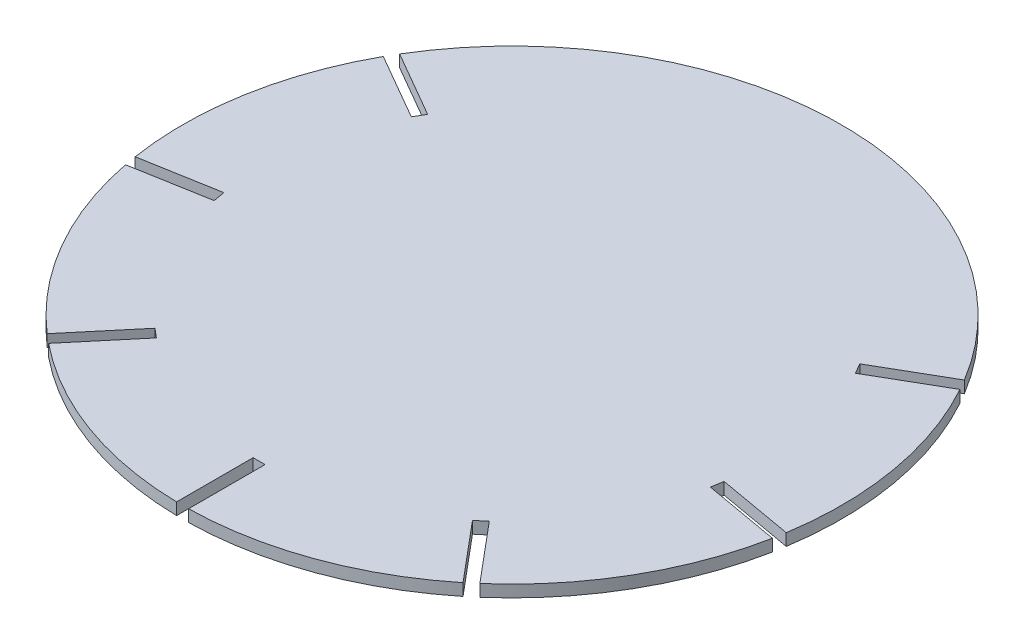
ISO-10303-21;
HEADER;
FILE_DESCRIPTION(('STEP AP214'),'2;1');
FILE_NAME('part.step','',(''),(''),'','','');
FILE_SCHEMA(('AUTOMOTIVE_DESIGN { 1 0 10303 214 1 1 1 1 }'));
ENDSEC;
DATA;
#1=APPLICATION_CONTEXT('core data for automotive mechanical design processes');
#2=APPLICATION_PROTOCOL_DEFINITION('international standard','automotive_design',2000,#1);
#3=PRODUCT_CONTEXT('',#1,'mechanical');
#4=PRODUCT('Part','Part','',(#3));
#5=PRODUCT_RELATED_PRODUCT_CATEGORY('part','',(#4));
#6=PRODUCT_DEFINITION_FORMATION('','',#4);
#7=PRODUCT_DEFINITION_CONTEXT('part definition',#1,'design');
#8=PRODUCT_DEFINITION('design','',#6,#7);
#9=PRODUCT_DEFINITION_SHAPE('','',#8);
#10=(LENGTH_UNIT() NAMED_UNIT(*) SI_UNIT(.MILLI.,.METRE.));
#11=(NAMED_UNIT(*) PLANE_ANGLE_UNIT() SI_UNIT($,.RADIAN.));
#12=(NAMED_UNIT(*) SI_UNIT($,.STERADIAN.) SOLID_ANGLE_UNIT());
#13=UNCERTAINTY_MEASURE_WITH_UNIT(LENGTH_MEASURE(1.E-05),#10,'distance_accuracy_value','');
#14=(GEOMETRIC_REPRESENTATION_CONTEXT(3) GLOBAL_UNCERTAINTY_ASSIGNED_CONTEXT((#13)) GLOBAL_UNIT_ASSIGNED_CONTEXT((#10,
#11,#12)) REPRESENTATION_CONTEXT('',''));
#15=CARTESIAN_POINT('',(0.,0.,0.));
#16=DIRECTION('',(0.,0.,1.));
#17=DIRECTION('',(1.,0.,0.));
#18=AXIS2_PLACEMENT_3D('',#15,#16,#17);
#19=CARTESIAN_POINT('',(0.,6.7,0.));
#20=DIRECTION('',(0.,-1.,0.));
#21=DIRECTION('',(0.,0.,-1.));
#22=AXIS2_PLACEMENT_3D('',#19,#20,#21);
#23=CYLINDRICAL_SURFACE('',#22,185.);
#24=DIRECTION('',(0.,-1.,0.));
#25=VECTOR('',#24,1.);
#26=CARTESIAN_POINT('',(182.741282969592,6.7,28.8205395270016));
#27=LINE('',#26,#25);
#28=CARTESIAN_POINT('',(182.741282969592,0.,28.8205395270016));
#29=VERTEX_POINT('',#28);
#30=CARTESIAN_POINT('',(182.741282969592,6.7,28.8205395270016));
#31=VERTEX_POINT('',#30);
#32=EDGE_CURVE('E238',#29,#31,#27,.F.);
#33=ORIENTED_EDGE('',*,*,#32,.F.);
#34=CARTESIAN_POINT('',(0.,0.,0.));
#35=DIRECTION('',(0.,1.,0.));
#36=DIRECTION('',(0.,0.,1.));
#37=AXIS2_PLACEMENT_3D('',#34,#35,#36);
#38=CIRCLE('',#37,185.);
#39=CARTESIAN_POINT('',(161.863430059726,0.,-89.5836481133697));
#40=VERTEX_POINT('',#39);
#41=EDGE_CURVE('E401',#29,#40,#38,.T.);
#42=ORIENTED_EDGE('',*,*,#41,.T.);
#43=DIRECTION('',(0.,-1.,0.));
#44=VECTOR('',#43,1.);
#45=CARTESIAN_POINT('',(161.863430059726,6.7,-89.5836481133697));
#46=LINE('',#45,#44);
#47=CARTESIAN_POINT('',(161.863430059726,6.7,-89.5836481133697));
#48=VERTEX_POINT('',#47);
#49=EDGE_CURVE('E396',#40,#48,#46,.F.);
#50=ORIENTED_EDGE('',*,*,#49,.T.);
#51=CARTESIAN_POINT('',(0.,6.7,0.));
#52=DIRECTION('',(0.,1.,0.));
#53=DIRECTION('',(0.,0.,1.));
#54=AXIS2_PLACEMENT_3D('',#51,#52,#53);
#55=CIRCLE('',#54,185.);
#56=EDGE_CURVE('E42',#31,#48,#55,.T.);
#57=ORIENTED_EDGE('',*,*,#56,.F.);
#58=EDGE_LOOP('',(#33,#42,#50,#57));
#59=FACE_BOUND('',#58,.T.);
#60=ADVANCED_FACE('F32',(#59),#23,.T.);
#61=CARTESIAN_POINT('',(121.462458634851,0.,139.541646623426));
#62=VERTEX_POINT('',#61);
#63=CARTESIAN_POINT('',(181.577840179224,0.,35.4187514721835));
#64=VERTEX_POINT('',#63);
#65=EDGE_CURVE('E405',#62,#64,#38,.T.);
#66=ORIENTED_EDGE('',*,*,#65,.T.);
#67=DIRECTION('',(0.,-1.,0.));
#68=VECTOR('',#67,1.);
#69=CARTESIAN_POINT('',(181.577840179224,6.7,35.4187514721835));
#70=LINE('',#69,#68);
#71=CARTESIAN_POINT('',(181.577840179224,6.7,35.4187514721834));
#72=VERTEX_POINT('',#71);
#73=EDGE_CURVE('E49',#64,#72,#70,.F.);
#74=ORIENTED_EDGE('',*,*,#73,.T.);
#75=CARTESIAN_POINT('',(121.462458634851,6.7,139.541646623426));
#76=VERTEX_POINT('',#75);
#77=EDGE_CURVE('E415',#76,#72,#55,.T.);
#78=ORIENTED_EDGE('',*,*,#77,.F.);
#79=DIRECTION('',(0.,-1.,0.));
#80=VECTOR('',#79,1.);
#81=CARTESIAN_POINT('',(121.462458634851,6.7,139.541646623426));
#82=LINE('',#81,#80);
#83=EDGE_CURVE('E372',#62,#76,#82,.F.);
#84=ORIENTED_EDGE('',*,*,#83,.F.);
#85=EDGE_LOOP('',(#66,#74,#78,#84));
#86=FACE_BOUND('',#85,.T.);
#87=ADVANCED_FACE('F457',(#86),#23,.T.);
#88=CARTESIAN_POINT('',(3.34999999999996,0.,184.969666432094));
#89=VERTEX_POINT('',#88);
#90=CARTESIAN_POINT('',(116.329960865954,0.,143.848323608326));
#91=VERTEX_POINT('',#90);
#92=EDGE_CURVE('E410',#89,#91,#38,.T.);
#93=ORIENTED_EDGE('',*,*,#92,.T.);
#94=DIRECTION('',(0.,-1.,0.));
#95=VECTOR('',#94,1.);
#96=CARTESIAN_POINT('',(116.329960865954,6.7,143.848323608326));
#97=LINE('',#96,#95);
#98=CARTESIAN_POINT('',(116.329960865954,6.7,143.848323608326));
#99=VERTEX_POINT('',#98);
#100=EDGE_CURVE('E57',#91,#99,#97,.F.);
#101=ORIENTED_EDGE('',*,*,#100,.T.);
#102=CARTESIAN_POINT('',(3.34999999999996,6.7,184.969666432094));
#103=VERTEX_POINT('',#102);
#104=EDGE_CURVE('E448',#103,#99,#55,.T.);
#105=ORIENTED_EDGE('',*,*,#104,.F.);
#106=DIRECTION('',(0.,-1.,0.));
#107=VECTOR('',#106,1.);
#108=CARTESIAN_POINT('',(3.34999999999996,6.7,184.969666432094));
#109=LINE('',#108,#107);
#110=EDGE_CURVE('E369',#89,#103,#109,.F.);
#111=ORIENTED_EDGE('',*,*,#110,.F.);
#112=EDGE_LOOP('',(#93,#101,#105,#111));
#113=FACE_BOUND('',#112,.T.);
#114=ADVANCED_FACE('F434',(#113),#23,.T.);
#115=CARTESIAN_POINT('',(-116.329960865954,0.,143.848323608326));
#116=VERTEX_POINT('',#115);
#117=CARTESIAN_POINT('',(-3.35000000000006,0.,184.969666432094));
#118=VERTEX_POINT('',#117);
#119=EDGE_CURVE('E422',#116,#118,#38,.T.);
#120=ORIENTED_EDGE('',*,*,#119,.T.);
#121=DIRECTION('',(0.,-1.,0.));
#122=VECTOR('',#121,1.);
#123=CARTESIAN_POINT('',(-3.35000000000006,6.7,184.969666432094));
#124=LINE('',#123,#122);
#125=CARTESIAN_POINT('',(-3.35000000000006,6.7,184.969666432094));
#126=VERTEX_POINT('',#125);
#127=EDGE_CURVE('E366',#118,#126,#124,.F.);
#128=ORIENTED_EDGE('',*,*,#127,.T.);
#129=CARTESIAN_POINT('',(-116.329960865954,6.7,143.848323608326));
#130=VERTEX_POINT('',#129);
#131=EDGE_CURVE('E451',#130,#126,#55,.T.);
#132=ORIENTED_EDGE('',*,*,#131,.F.);
#133=DIRECTION('',(0.,-1.,0.));
#134=VECTOR('',#133,1.);
#135=CARTESIAN_POINT('',(-116.329960865954,6.7,143.848323608326));
#136=LINE('',#135,#134);
#137=EDGE_CURVE('E364',#116,#130,#136,.F.);
#138=ORIENTED_EDGE('',*,*,#137,.F.);
#139=EDGE_LOOP('',(#120,#128,#132,#138));
#140=FACE_BOUND('',#139,.T.);
#141=ADVANCED_FACE('F489',(#140),#23,.T.);
#142=CARTESIAN_POINT('',(-181.577840179224,0.,35.4187514721832));
#143=VERTEX_POINT('',#142);
#144=CARTESIAN_POINT('',(-121.462458634851,0.,139.541646623426));
#145=VERTEX_POINT('',#144);
#146=EDGE_CURVE('E417',#143,#145,#38,.T.);
#147=ORIENTED_EDGE('',*,*,#146,.T.);
#148=DIRECTION('',(0.,-1.,0.));
#149=VECTOR('',#148,1.);
#150=CARTESIAN_POINT('',(-121.462458634851,6.7,139.541646623426));
#151=LINE('',#150,#149);
#152=CARTESIAN_POINT('',(-121.462458634851,6.7,139.541646623426));
#153=VERTEX_POINT('',#152);
#154=EDGE_CURVE('E361',#145,#153,#151,.F.);
#155=ORIENTED_EDGE('',*,*,#154,.T.);
#156=CARTESIAN_POINT('',(-181.577840179224,6.7,35.4187514721832));
#157=VERTEX_POINT('',#156);
#158=EDGE_CURVE('E453',#157,#153,#55,.T.);
#159=ORIENTED_EDGE('',*,*,#158,.F.);
#160=DIRECTION('',(0.,-1.,0.));
#161=VECTOR('',#160,1.);
#162=CARTESIAN_POINT('',(-181.577840179224,6.7,35.4187514721832));
#163=LINE('',#162,#161);
#164=EDGE_CURVE('E359',#143,#157,#163,.F.);
#165=ORIENTED_EDGE('',*,*,#164,.F.);
#166=EDGE_LOOP('',(#147,#155,#159,#165));
#167=FACE_BOUND('',#166,.T.);
#168=ADVANCED_FACE('F483',(#167),#23,.T.);
#169=CARTESIAN_POINT('',(-161.863430059726,0.,-89.5836481133698));
#170=VERTEX_POINT('',#169);
#171=CARTESIAN_POINT('',(-182.741282969592,0.,28.8205395270014));
#172=VERTEX_POINT('',#171);
#173=EDGE_CURVE('E412',#170,#172,#38,.T.);
#174=ORIENTED_EDGE('',*,*,#173,.T.);
#175=DIRECTION('',(0.,-1.,0.));
#176=VECTOR('',#175,1.);
#177=CARTESIAN_POINT('',(-182.741282969592,6.7,28.8205395270014));
#178=LINE('',#177,#176);
#179=CARTESIAN_POINT('',(-182.741282969592,6.7,28.8205395270014));
#180=VERTEX_POINT('',#179);
#181=EDGE_CURVE('E356',#172,#180,#178,.F.);
#182=ORIENTED_EDGE('',*,*,#181,.T.);
#183=CARTESIAN_POINT('',(-161.863430059726,6.7,-89.5836481133698));
#184=VERTEX_POINT('',#183);
#185=EDGE_CURVE('E41',#184,#180,#55,.T.);
#186=ORIENTED_EDGE('',*,*,#185,.F.);
#187=DIRECTION('',(0.,-1.,0.));
#188=VECTOR('',#187,1.);
#189=CARTESIAN_POINT('',(-161.863430059726,6.7,-89.5836481133697));
#190=LINE('',#189,#188);
#191=EDGE_CURVE('E248',#170,#184,#190,.F.);
#192=ORIENTED_EDGE('',*,*,#191,.F.);
#193=EDGE_LOOP('',(#174,#182,#186,#192));
#194=FACE_BOUND('',#193,.T.);
#195=ADVANCED_FACE('F475',(#194),#23,.T.);
#196=CARTESIAN_POINT('',(0.,6.7,0.));
#197=DIRECTION('',(0.,1.,0.));
#198=DIRECTION('',(0.,0.,1.));
#199=AXIS2_PLACEMENT_3D('',#196,#197,#198);
#200=PLANE('',#199);
#201=DIRECTION('',(-0.173648177666925,0.,0.984807753012209));
#202=VECTOR('',#201,1.);
#203=CARTESIAN_POINT('',(140.424422322918,6.7,21.3589352561128));
#204=LINE('',#203,#202);
#205=CARTESIAN_POINT('',(140.424422322918,6.7,21.3589352561128));
#206=VERTEX_POINT('',#205);
#207=CARTESIAN_POINT('',(139.260979532549,6.7,27.9571472012946));
#208=VERTEX_POINT('',#207);
#209=EDGE_CURVE('E225',#206,#208,#204,.T.);
#210=ORIENTED_EDGE('',*,*,#209,.F.);
#211=DIRECTION('',(0.984807753012209,0.,0.173648177666928));
#212=VECTOR('',#211,1.);
#213=CARTESIAN_POINT('',(140.424422322918,6.7,21.3589352561128));
#214=LINE('',#213,#212);
#215=EDGE_CURVE('E235',#206,#31,#214,.T.);
#216=ORIENTED_EDGE('',*,*,#215,.T.);
#217=ORIENTED_EDGE('',*,*,#56,.T.);
#218=DIRECTION('',(0.866025403784436,0.,-0.500000000000004));
#219=VECTOR('',#218,1.);
#220=CARTESIAN_POINT('',(124.65060733739,6.7,-68.0988148973227));
#221=LINE('',#220,#219);
#222=CARTESIAN_POINT('',(124.65060733739,6.7,-68.0988148973227));
#223=VERTEX_POINT('',#222);
#224=EDGE_CURVE('E389',#223,#48,#221,.T.);
#225=ORIENTED_EDGE('',*,*,#224,.F.);
#226=DIRECTION('',(0.500000000000007,0.,0.866025403784434));
#227=VECTOR('',#226,1.);
#228=CARTESIAN_POINT('',(121.30060733739,6.7,-73.9011851026784));
#229=LINE('',#228,#227);
#230=CARTESIAN_POINT('',(121.30060733739,6.7,-73.9011851026784));
#231=VERTEX_POINT('',#230);
#232=EDGE_CURVE('E376',#231,#223,#229,.T.);
#233=ORIENTED_EDGE('',*,*,#232,.F.);
#234=DIRECTION('',(0.866025403784436,0.,-0.500000000000004));
#235=VECTOR('',#234,1.);
#236=CARTESIAN_POINT('',(121.30060733739,6.7,-73.9011851026784));
#237=LINE('',#236,#235);
#238=CARTESIAN_POINT('',(158.513430059726,6.7,-95.3860183187254));
#239=VERTEX_POINT('',#238);
#240=EDGE_CURVE('E381',#231,#239,#237,.T.);
#241=ORIENTED_EDGE('',*,*,#240,.T.);
#242=CARTESIAN_POINT('',(-158.513430059726,6.7,-95.3860183187255));
#243=VERTEX_POINT('',#242);
#244=EDGE_CURVE('E11',#239,#243,#55,.T.);
#245=ORIENTED_EDGE('',*,*,#244,.T.);
#246=DIRECTION('',(-0.866025403784436,0.,-0.500000000000005));
#247=VECTOR('',#246,1.);
#248=CARTESIAN_POINT('',(-121.30060733739,6.7,-73.9011851026784));
#249=LINE('',#248,#247);
#250=CARTESIAN_POINT('',(-121.30060733739,6.7,-73.9011851026784));
#251=VERTEX_POINT('',#250);
#252=EDGE_CURVE('E344',#251,#243,#249,.T.);
#253=ORIENTED_EDGE('',*,*,#252,.F.);
#254=DIRECTION('',(0.5,0.,-0.866025403784439));
#255=VECTOR('',#254,1.);
#256=CARTESIAN_POINT('',(-124.65060733739,6.7,-68.0988148973227));
#257=LINE('',#256,#255);
#258=CARTESIAN_POINT('',(-124.65060733739,6.7,-68.0988148973227));
#259=VERTEX_POINT('',#258);
#260=EDGE_CURVE('E321',#259,#251,#257,.T.);
#261=ORIENTED_EDGE('',*,*,#260,.F.);
#262=DIRECTION('',(-0.866025403784436,0.,-0.500000000000004));
#263=VECTOR('',#262,1.);
#264=CARTESIAN_POINT('',(-124.65060733739,6.7,-68.0988148973227));
#265=LINE('',#264,#263);
#266=EDGE_CURVE('E341',#259,#184,#265,.T.);
#267=ORIENTED_EDGE('',*,*,#266,.T.);
#268=ORIENTED_EDGE('',*,*,#185,.T.);
#269=DIRECTION('',(-0.984807753012209,0.,0.173648177666926));
#270=VECTOR('',#269,1.);
#271=CARTESIAN_POINT('',(-140.424422322918,6.7,21.3589352561126));
#272=LINE('',#271,#270);
#273=CARTESIAN_POINT('',(-140.424422322918,6.7,21.3589352561126));
#274=VERTEX_POINT('',#273);
#275=EDGE_CURVE('E325',#274,#180,#272,.T.);
#276=ORIENTED_EDGE('',*,*,#275,.F.);
#277=DIRECTION('',(-0.173648177666933,0.,-0.984807753012208));
#278=VECTOR('',#277,1.);
#279=CARTESIAN_POINT('',(-139.260979532549,6.7,27.9571472012944));
#280=LINE('',#279,#278);
#281=CARTESIAN_POINT('',(-139.260979532549,6.7,27.9571472012944));
#282=VERTEX_POINT('',#281);
#283=EDGE_CURVE('E301',#282,#274,#280,.T.);
#284=ORIENTED_EDGE('',*,*,#283,.F.);
#285=DIRECTION('',(-0.984807753012209,0.,0.173648177666927));
#286=VECTOR('',#285,1.);
#287=CARTESIAN_POINT('',(-139.260979532549,6.7,27.9571472012944));
#288=LINE('',#287,#286);
#289=EDGE_CURVE('E322',#282,#157,#288,.T.);
#290=ORIENTED_EDGE('',*,*,#289,.T.);
#291=ORIENTED_EDGE('',*,*,#158,.T.);
#292=DIRECTION('',(-0.642787609686541,0.,0.766044443118977));
#293=VECTOR('',#292,1.);
#294=CARTESIAN_POINT('',(-93.8420894599374,6.7,106.624972430445));
#295=LINE('',#294,#293);
#296=CARTESIAN_POINT('',(-93.8420894599374,6.7,106.624972430445));
#297=VERTEX_POINT('',#296);
#298=EDGE_CURVE('E305',#297,#153,#295,.T.);
#299=ORIENTED_EDGE('',*,*,#298,.F.);
#300=DIRECTION('',(-0.766044443118978,0.,-0.642787609686539));
#301=VECTOR('',#300,1.);
#302=CARTESIAN_POINT('',(-88.7095916910402,6.7,110.931649415345));
#303=LINE('',#302,#301);
#304=CARTESIAN_POINT('',(-88.7095916910402,6.7,110.931649415345));
#305=VERTEX_POINT('',#304);
#306=EDGE_CURVE('E281',#305,#297,#303,.T.);
#307=ORIENTED_EDGE('',*,*,#306,.F.);
#308=DIRECTION('',(-0.642787609686541,0.,0.766044443118976));
#309=VECTOR('',#308,1.);
#310=CARTESIAN_POINT('',(-88.7095916910402,6.7,110.931649415345));
#311=LINE('',#310,#309);
#312=EDGE_CURVE('E302',#305,#130,#311,.T.);
#313=ORIENTED_EDGE('',*,*,#312,.T.);
#314=ORIENTED_EDGE('',*,*,#131,.T.);
#315=DIRECTION('',(0.,0.,1.));
#316=VECTOR('',#315,1.);
#317=CARTESIAN_POINT('',(-3.35000000000005,6.7,142.));
#318=LINE('',#317,#316);
#319=CARTESIAN_POINT('',(-3.35000000000005,6.7,142.));
#320=VERTEX_POINT('',#319);
#321=EDGE_CURVE('E285',#320,#126,#318,.T.);
#322=ORIENTED_EDGE('',*,*,#321,.F.);
#323=DIRECTION('',(-1.,0.,0.));
#324=VECTOR('',#323,1.);
#325=CARTESIAN_POINT('',(3.34999999999993,6.7,142.));
#326=LINE('',#325,#324);
#327=CARTESIAN_POINT('',(3.34999999999993,6.7,142.));
#328=VERTEX_POINT('',#327);
#329=EDGE_CURVE('E262',#328,#320,#326,.T.);
#330=ORIENTED_EDGE('',*,*,#329,.F.);
#331=DIRECTION('',(0.,0.,1.));
#332=VECTOR('',#331,1.);
#333=CARTESIAN_POINT('',(3.34999999999993,6.7,142.));
#334=LINE('',#333,#332);
#335=EDGE_CURVE('E282',#328,#103,#334,.T.);
#336=ORIENTED_EDGE('',*,*,#335,.T.);
#337=ORIENTED_EDGE('',*,*,#104,.T.);
#338=DIRECTION('',(0.64278760968654,0.,0.766044443118977));
#339=VECTOR('',#338,1.);
#340=CARTESIAN_POINT('',(88.7095916910401,6.7,110.931649415345));
#341=LINE('',#340,#339);
#342=CARTESIAN_POINT('',(88.7095916910401,6.7,110.931649415345));
#343=VERTEX_POINT('',#342);
#344=EDGE_CURVE('E266',#343,#99,#341,.T.);
#345=ORIENTED_EDGE('',*,*,#344,.F.);
#346=DIRECTION('',(-0.766044443118975,0.,0.642787609686543));
#347=VECTOR('',#346,1.);
#348=CARTESIAN_POINT('',(93.8420894599372,6.7,106.624972430445));
#349=LINE('',#348,#347);
#350=CARTESIAN_POINT('',(93.8420894599372,6.7,106.624972430445));
#351=VERTEX_POINT('',#350);
#352=EDGE_CURVE('E232',#351,#343,#349,.T.);
#353=ORIENTED_EDGE('',*,*,#352,.F.);
#354=DIRECTION('',(0.64278760968654,0.,0.766044443118977));
#355=VECTOR('',#354,1.);
#356=CARTESIAN_POINT('',(93.8420894599372,6.7,106.624972430445));
#357=LINE('',#356,#355);
#358=EDGE_CURVE('E263',#351,#76,#357,.T.);
#359=ORIENTED_EDGE('',*,*,#358,.T.);
#360=ORIENTED_EDGE('',*,*,#77,.T.);
#361=DIRECTION('',(0.984807753012208,0.,0.173648177666927));
#362=VECTOR('',#361,1.);
#363=CARTESIAN_POINT('',(139.260979532549,6.7,27.9571472012946));
#364=LINE('',#363,#362);
#365=EDGE_CURVE('E241',#208,#72,#364,.T.);
#366=ORIENTED_EDGE('',*,*,#365,.F.);
#367=EDGE_LOOP('',(#210,#216,#217,#225,#233,#241,#245,#253,#261,#267,#268,#276,#284,#290,#291,
#299,#307,#313,#314,#322,#330,#336,#337,#345,#353,#359,#360,#366));
#368=FACE_BOUND('',#367,.T.);
#369=ADVANCED_FACE('F243',(#368),#200,.T.);
#370=CARTESIAN_POINT('',(0.,0.,0.));
#371=DIRECTION('',(0.,1.,0.));
#372=DIRECTION('',(0.,0.,1.));
#373=AXIS2_PLACEMENT_3D('',#370,#371,#372);
#374=PLANE('',#373);
#375=DIRECTION('',(0.984807753012209,0.,0.173648177666928));
#376=VECTOR('',#375,1.);
#377=CARTESIAN_POINT('',(140.424422322918,0.,21.3589352561128));
#378=LINE('',#377,#376);
#379=CARTESIAN_POINT('',(140.424422322918,0.,21.3589352561128));
#380=VERTEX_POINT('',#379);
#381=EDGE_CURVE('E252',#380,#29,#378,.T.);
#382=ORIENTED_EDGE('',*,*,#381,.F.);
#383=DIRECTION('',(-0.173648177666925,0.,0.984807753012209));
#384=VECTOR('',#383,1.);
#385=CARTESIAN_POINT('',(140.424422322918,0.,21.3589352561128));
#386=LINE('',#385,#384);
#387=CARTESIAN_POINT('',(139.260979532549,0.,27.9571472012946));
#388=VERTEX_POINT('',#387);
#389=EDGE_CURVE('E228',#380,#388,#386,.T.);
#390=ORIENTED_EDGE('',*,*,#389,.T.);
#391=DIRECTION('',(0.984807753012208,0.,0.173648177666927));
#392=VECTOR('',#391,1.);
#393=CARTESIAN_POINT('',(139.260979532549,0.,27.9571472012946));
#394=LINE('',#393,#392);
#395=EDGE_CURVE('E254',#388,#64,#394,.T.);
#396=ORIENTED_EDGE('',*,*,#395,.T.);
#397=ORIENTED_EDGE('',*,*,#65,.F.);
#398=DIRECTION('',(0.64278760968654,0.,0.766044443118977));
#399=VECTOR('',#398,1.);
#400=CARTESIAN_POINT('',(93.8420894599372,0.,106.624972430445));
#401=LINE('',#400,#399);
#402=CARTESIAN_POINT('',(93.8420894599372,0.,106.624972430445));
#403=VERTEX_POINT('',#402);
#404=EDGE_CURVE('E259',#403,#62,#401,.T.);
#405=ORIENTED_EDGE('',*,*,#404,.F.);
#406=DIRECTION('',(-0.766044443118975,0.,0.642787609686543));
#407=VECTOR('',#406,1.);
#408=CARTESIAN_POINT('',(93.8420894599372,0.,106.624972430445));
#409=LINE('',#408,#407);
#410=CARTESIAN_POINT('',(88.7095916910401,0.,110.931649415345));
#411=VERTEX_POINT('',#410);
#412=EDGE_CURVE('E267',#403,#411,#409,.T.);
#413=ORIENTED_EDGE('',*,*,#412,.T.);
#414=DIRECTION('',(0.64278760968654,0.,0.766044443118977));
#415=VECTOR('',#414,1.);
#416=CARTESIAN_POINT('',(88.7095916910401,0.,110.931649415345));
#417=LINE('',#416,#415);
#418=EDGE_CURVE('E272',#411,#91,#417,.T.);
#419=ORIENTED_EDGE('',*,*,#418,.T.);
#420=ORIENTED_EDGE('',*,*,#92,.F.);
#421=DIRECTION('',(0.,0.,1.));
#422=VECTOR('',#421,1.);
#423=CARTESIAN_POINT('',(3.34999999999993,0.,142.));
#424=LINE('',#423,#422);
#425=CARTESIAN_POINT('',(3.34999999999993,0.,142.));
#426=VERTEX_POINT('',#425);
#427=EDGE_CURVE('E278',#426,#89,#424,.T.);
#428=ORIENTED_EDGE('',*,*,#427,.F.);
#429=DIRECTION('',(-1.,0.,0.));
#430=VECTOR('',#429,1.);
#431=CARTESIAN_POINT('',(3.34999999999993,0.,142.));
#432=LINE('',#431,#430);
#433=CARTESIAN_POINT('',(-3.35000000000005,0.,142.));
#434=VERTEX_POINT('',#433);
#435=EDGE_CURVE('E286',#426,#434,#432,.T.);
#436=ORIENTED_EDGE('',*,*,#435,.T.);
#437=DIRECTION('',(0.,0.,1.));
#438=VECTOR('',#437,1.);
#439=CARTESIAN_POINT('',(-3.35000000000005,0.,142.));
#440=LINE('',#439,#438);
#441=EDGE_CURVE('E291',#434,#118,#440,.T.);
#442=ORIENTED_EDGE('',*,*,#441,.T.);
#443=ORIENTED_EDGE('',*,*,#119,.F.);
#444=DIRECTION('',(-0.642787609686541,0.,0.766044443118976));
#445=VECTOR('',#444,1.);
#446=CARTESIAN_POINT('',(-88.7095916910402,0.,110.931649415345));
#447=LINE('',#446,#445);
#448=CARTESIAN_POINT('',(-88.7095916910402,0.,110.931649415345));
#449=VERTEX_POINT('',#448);
#450=EDGE_CURVE('E298',#449,#116,#447,.T.);
#451=ORIENTED_EDGE('',*,*,#450,.F.);
#452=DIRECTION('',(-0.766044443118978,0.,-0.642787609686539));
#453=VECTOR('',#452,1.);
#454=CARTESIAN_POINT('',(-88.7095916910402,0.,110.931649415345));
#455=LINE('',#454,#453);
#456=CARTESIAN_POINT('',(-93.8420894599374,0.,106.624972430445));
#457=VERTEX_POINT('',#456);
#458=EDGE_CURVE('E306',#449,#457,#455,.T.);
#459=ORIENTED_EDGE('',*,*,#458,.T.);
#460=DIRECTION('',(-0.642787609686541,0.,0.766044443118977));
#461=VECTOR('',#460,1.);
#462=CARTESIAN_POINT('',(-93.8420894599374,0.,106.624972430445));
#463=LINE('',#462,#461);
#464=EDGE_CURVE('E311',#457,#145,#463,.T.);
#465=ORIENTED_EDGE('',*,*,#464,.T.);
#466=ORIENTED_EDGE('',*,*,#146,.F.);
#467=DIRECTION('',(-0.984807753012209,0.,0.173648177666927));
#468=VECTOR('',#467,1.);
#469=CARTESIAN_POINT('',(-139.260979532549,0.,27.9571472012944));
#470=LINE('',#469,#468);
#471=CARTESIAN_POINT('',(-139.260979532549,0.,27.9571472012944));
#472=VERTEX_POINT('',#471);
#473=EDGE_CURVE('E318',#472,#143,#470,.T.);
#474=ORIENTED_EDGE('',*,*,#473,.F.);
#475=DIRECTION('',(-0.173648177666933,0.,-0.984807753012208));
#476=VECTOR('',#475,1.);
#477=CARTESIAN_POINT('',(-139.260979532549,0.,27.9571472012944));
#478=LINE('',#477,#476);
#479=CARTESIAN_POINT('',(-140.424422322918,0.,21.3589352561126));
#480=VERTEX_POINT('',#479);
#481=EDGE_CURVE('E326',#472,#480,#478,.T.);
#482=ORIENTED_EDGE('',*,*,#481,.T.);
#483=DIRECTION('',(-0.984807753012209,0.,0.173648177666926));
#484=VECTOR('',#483,1.);
#485=CARTESIAN_POINT('',(-140.424422322918,0.,21.3589352561126));
#486=LINE('',#485,#484);
#487=EDGE_CURVE('E331',#480,#172,#486,.T.);
#488=ORIENTED_EDGE('',*,*,#487,.T.);
#489=ORIENTED_EDGE('',*,*,#173,.F.);
#490=DIRECTION('',(-0.866025403784436,0.,-0.500000000000004));
#491=VECTOR('',#490,1.);
#492=CARTESIAN_POINT('',(-124.65060733739,0.,-68.0988148973227));
#493=LINE('',#492,#491);
#494=CARTESIAN_POINT('',(-124.65060733739,0.,-68.0988148973227));
#495=VERTEX_POINT('',#494);
#496=EDGE_CURVE('E338',#495,#170,#493,.T.);
#497=ORIENTED_EDGE('',*,*,#496,.F.);
#498=DIRECTION('',(0.5,0.,-0.866025403784439));
#499=VECTOR('',#498,1.);
#500=CARTESIAN_POINT('',(-124.65060733739,0.,-68.0988148973227));
#501=LINE('',#500,#499);
#502=CARTESIAN_POINT('',(-121.30060733739,0.,-73.9011851026784));
#503=VERTEX_POINT('',#502);
#504=EDGE_CURVE('E345',#495,#503,#501,.T.);
#505=ORIENTED_EDGE('',*,*,#504,.T.);
#506=DIRECTION('',(-0.866025403784436,0.,-0.500000000000005));
#507=VECTOR('',#506,1.);
#508=CARTESIAN_POINT('',(-121.30060733739,0.,-73.9011851026784));
#509=LINE('',#508,#507);
#510=CARTESIAN_POINT('',(-158.513430059726,0.,-95.3860183187255));
#511=VERTEX_POINT('',#510);
#512=EDGE_CURVE('E350',#503,#511,#509,.T.);
#513=ORIENTED_EDGE('',*,*,#512,.T.);
#514=CARTESIAN_POINT('',(158.513430059726,0.,-95.3860183187254));
#515=VERTEX_POINT('',#514);
#516=EDGE_CURVE('E36',#515,#511,#38,.T.);
#517=ORIENTED_EDGE('',*,*,#516,.F.);
#518=DIRECTION('',(0.866025403784436,0.,-0.500000000000004));
#519=VECTOR('',#518,1.);
#520=CARTESIAN_POINT('',(121.30060733739,0.,-73.9011851026784));
#521=LINE('',#520,#519);
#522=CARTESIAN_POINT('',(121.30060733739,0.,-73.9011851026784));
#523=VERTEX_POINT('',#522);
#524=EDGE_CURVE('E384',#523,#515,#521,.T.);
#525=ORIENTED_EDGE('',*,*,#524,.F.);
#526=DIRECTION('',(0.500000000000007,0.,0.866025403784434));
#527=VECTOR('',#526,1.);
#528=CARTESIAN_POINT('',(121.30060733739,0.,-73.9011851026784));
#529=LINE('',#528,#527);
#530=CARTESIAN_POINT('',(124.65060733739,0.,-68.0988148973227));
#531=VERTEX_POINT('',#530);
#532=EDGE_CURVE('E377',#523,#531,#529,.T.);
#533=ORIENTED_EDGE('',*,*,#532,.T.);
#534=DIRECTION('',(0.866025403784436,0.,-0.500000000000004));
#535=VECTOR('',#534,1.);
#536=CARTESIAN_POINT('',(124.65060733739,0.,-68.0988148973227));
#537=LINE('',#536,#535);
#538=EDGE_CURVE('E380',#531,#40,#537,.T.);
#539=ORIENTED_EDGE('',*,*,#538,.T.);
#540=ORIENTED_EDGE('',*,*,#41,.F.);
#541=EDGE_LOOP('',(#382,#390,#396,#397,#405,#413,#419,#420,#428,#436,#442,#443,#451,#459,#465,
#466,#474,#482,#488,#489,#497,#505,#513,#517,#525,#533,#539,#540));
#542=FACE_BOUND('',#541,.T.);
#543=ADVANCED_FACE('F439',(#542),#374,.F.);
#544=ORIENTED_EDGE('',*,*,#516,.T.);
#545=DIRECTION('',(0.,-1.,0.));
#546=VECTOR('',#545,1.);
#547=CARTESIAN_POINT('',(-158.513430059726,6.7,-95.3860183187255));
#548=LINE('',#547,#546);
#549=EDGE_CURVE('E245',#511,#243,#548,.F.);
#550=ORIENTED_EDGE('',*,*,#549,.T.);
#551=ORIENTED_EDGE('',*,*,#244,.F.);
#552=DIRECTION('',(0.,-1.,0.));
#553=VECTOR('',#552,1.);
#554=CARTESIAN_POINT('',(158.513430059726,6.7,-95.3860183187254));
#555=LINE('',#554,#553);
#556=EDGE_CURVE('E400',#515,#239,#555,.F.);
#557=ORIENTED_EDGE('',*,*,#556,.F.);
#558=EDGE_LOOP('',(#544,#550,#551,#557));
#559=FACE_BOUND('',#558,.T.);
#560=ADVANCED_FACE('F34',(#559),#23,.T.);
#561=CARTESIAN_POINT('',(121.30060733739,0.,-73.9011851026784));
#562=DIRECTION('',(0.500000000000005,0.,0.866025403784436));
#563=DIRECTION('',(0.866025403784436,0.,-0.500000000000005));
#564=AXIS2_PLACEMENT_3D('',#561,#562,#563);
#565=PLANE('',#564);
#566=ORIENTED_EDGE('',*,*,#556,.T.);
#567=ORIENTED_EDGE('',*,*,#240,.F.);
#568=DIRECTION('',(0.,1.,0.));
#569=VECTOR('',#568,1.);
#570=CARTESIAN_POINT('',(121.30060733739,0.,-73.9011851026784));
#571=LINE('',#570,#569);
#572=EDGE_CURVE('E394',#523,#231,#571,.T.);
#573=ORIENTED_EDGE('',*,*,#572,.F.);
#574=ORIENTED_EDGE('',*,*,#524,.T.);
#575=EDGE_LOOP('',(#566,#567,#573,#574));
#576=FACE_BOUND('',#575,.T.);
#577=ADVANCED_FACE('F474',(#576),#565,.T.);
#578=CARTESIAN_POINT('',(124.65060733739,0.,-68.0988148973227));
#579=DIRECTION('',(0.500000000000004,0.,0.866025403784436));
#580=DIRECTION('',(0.866025403784437,0.,-0.500000000000004));
#581=AXIS2_PLACEMENT_3D('',#578,#579,#580);
#582=PLANE('',#581);
#583=ORIENTED_EDGE('',*,*,#538,.F.);
#584=DIRECTION('',(0.,1.,0.));
#585=VECTOR('',#584,1.);
#586=CARTESIAN_POINT('',(124.65060733739,0.,-68.0988148973227));
#587=LINE('',#586,#585);
#588=EDGE_CURVE('E386',#531,#223,#587,.T.);
#589=ORIENTED_EDGE('',*,*,#588,.T.);
#590=ORIENTED_EDGE('',*,*,#224,.T.);
#591=ORIENTED_EDGE('',*,*,#49,.F.);
#592=EDGE_LOOP('',(#583,#589,#590,#591));
#593=FACE_BOUND('',#592,.T.);
#594=ADVANCED_FACE('F480',(#593),#582,.F.);
#595=CARTESIAN_POINT('',(121.30060733739,0.,-73.9011851026784));
#596=DIRECTION('',(-0.866025403784434,0.,0.500000000000007));
#597=DIRECTION('',(0.500000000000007,0.,0.866025403784434));
#598=AXIS2_PLACEMENT_3D('',#595,#596,#597);
#599=PLANE('',#598);
#600=ORIENTED_EDGE('',*,*,#232,.T.);
#601=ORIENTED_EDGE('',*,*,#588,.F.);
#602=ORIENTED_EDGE('',*,*,#532,.F.);
#603=ORIENTED_EDGE('',*,*,#572,.T.);
#604=EDGE_LOOP('',(#600,#601,#602,#603));
#605=FACE_BOUND('',#604,.T.);
#606=ADVANCED_FACE('F521',(#605),#599,.F.);
#607=CARTESIAN_POINT('',(-124.65060733739,0.,-68.0988148973227));
#608=DIRECTION('',(0.500000000000004,0.,-0.866025403784436));
#609=DIRECTION('',(-0.866025403784436,0.,-0.500000000000004));
#610=AXIS2_PLACEMENT_3D('',#607,#608,#609);
#611=PLANE('',#610);
#612=ORIENTED_EDGE('',*,*,#191,.T.);
#613=ORIENTED_EDGE('',*,*,#266,.F.);
#614=DIRECTION('',(0.,1.,0.));
#615=VECTOR('',#614,1.);
#616=CARTESIAN_POINT('',(-124.65060733739,0.,-68.0988148973227));
#617=LINE('',#616,#615);
#618=EDGE_CURVE('E339',#495,#259,#617,.T.);
#619=ORIENTED_EDGE('',*,*,#618,.F.);
#620=ORIENTED_EDGE('',*,*,#496,.T.);
#621=EDGE_LOOP('',(#612,#613,#619,#620));
#622=FACE_BOUND('',#621,.T.);
#623=ADVANCED_FACE('F530',(#622),#611,.T.);
#624=CARTESIAN_POINT('',(-121.30060733739,0.,-73.9011851026784));
#625=DIRECTION('',(0.500000000000005,0.,-0.866025403784436));
#626=DIRECTION('',(-0.866025403784436,0.,-0.500000000000005));
#627=AXIS2_PLACEMENT_3D('',#624,#625,#626);
#628=PLANE('',#627);
#629=ORIENTED_EDGE('',*,*,#512,.F.);
#630=DIRECTION('',(0.,1.,0.));
#631=VECTOR('',#630,1.);
#632=CARTESIAN_POINT('',(-121.30060733739,0.,-73.9011851026784));
#633=LINE('',#632,#631);
#634=EDGE_CURVE('E336',#503,#251,#633,.T.);
#635=ORIENTED_EDGE('',*,*,#634,.T.);
#636=ORIENTED_EDGE('',*,*,#252,.T.);
#637=ORIENTED_EDGE('',*,*,#549,.F.);
#638=EDGE_LOOP('',(#629,#635,#636,#637));
#639=FACE_BOUND('',#638,.T.);
#640=ADVANCED_FACE('F539',(#639),#628,.F.);
#641=CARTESIAN_POINT('',(-124.65060733739,0.,-68.0988148973227));
#642=DIRECTION('',(0.866025403784439,0.,0.5));
#643=DIRECTION('',(0.5,0.,-0.866025403784439));
#644=AXIS2_PLACEMENT_3D('',#641,#642,#643);
#645=PLANE('',#644);
#646=ORIENTED_EDGE('',*,*,#260,.T.);
#647=ORIENTED_EDGE('',*,*,#634,.F.);
#648=ORIENTED_EDGE('',*,*,#504,.F.);
#649=ORIENTED_EDGE('',*,*,#618,.T.);
#650=EDGE_LOOP('',(#646,#647,#648,#649));
#651=FACE_BOUND('',#650,.T.);
#652=ADVANCED_FACE('F548',(#651),#645,.F.);
#653=CARTESIAN_POINT('',(-139.260979532549,0.,27.9571472012944));
#654=DIRECTION('',(-0.173648177666927,0.,-0.984807753012209));
#655=DIRECTION('',(-0.984807753012209,0.,0.173648177666927));
#656=AXIS2_PLACEMENT_3D('',#653,#654,#655);
#657=PLANE('',#656);
#658=ORIENTED_EDGE('',*,*,#164,.T.);
#659=ORIENTED_EDGE('',*,*,#289,.F.);
#660=DIRECTION('',(0.,1.,0.));
#661=VECTOR('',#660,1.);
#662=CARTESIAN_POINT('',(-139.260979532549,0.,27.9571472012944));
#663=LINE('',#662,#661);
#664=EDGE_CURVE('E319',#472,#282,#663,.T.);
#665=ORIENTED_EDGE('',*,*,#664,.F.);
#666=ORIENTED_EDGE('',*,*,#473,.T.);
#667=EDGE_LOOP('',(#658,#659,#665,#666));
#668=FACE_BOUND('',#667,.T.);
#669=ADVANCED_FACE('F557',(#668),#657,.T.);
#670=CARTESIAN_POINT('',(-140.424422322918,0.,21.3589352561126));
#671=DIRECTION('',(-0.173648177666926,0.,-0.984807753012209));
#672=DIRECTION('',(-0.984807753012209,0.,0.173648177666926));
#673=AXIS2_PLACEMENT_3D('',#670,#671,#672);
#674=PLANE('',#673);
#675=ORIENTED_EDGE('',*,*,#487,.F.);
#676=DIRECTION('',(0.,1.,0.));
#677=VECTOR('',#676,1.);
#678=CARTESIAN_POINT('',(-140.424422322918,0.,21.3589352561126));
#679=LINE('',#678,#677);
#680=EDGE_CURVE('E316',#480,#274,#679,.T.);
#681=ORIENTED_EDGE('',*,*,#680,.T.);
#682=ORIENTED_EDGE('',*,*,#275,.T.);
#683=ORIENTED_EDGE('',*,*,#181,.F.);
#684=EDGE_LOOP('',(#675,#681,#682,#683));
#685=FACE_BOUND('',#684,.T.);
#686=ADVANCED_FACE('F566',(#685),#674,.F.);
#687=CARTESIAN_POINT('',(-139.260979532549,0.,27.9571472012944));
#688=DIRECTION('',(0.984807753012208,0.,-0.173648177666933));
#689=DIRECTION('',(-0.173648177666933,0.,-0.984807753012208));
#690=AXIS2_PLACEMENT_3D('',#687,#688,#689);
#691=PLANE('',#690);
#692=ORIENTED_EDGE('',*,*,#283,.T.);
#693=ORIENTED_EDGE('',*,*,#680,.F.);
#694=ORIENTED_EDGE('',*,*,#481,.F.);
#695=ORIENTED_EDGE('',*,*,#664,.T.);
#696=EDGE_LOOP('',(#692,#693,#694,#695));
#697=FACE_BOUND('',#696,.T.);
#698=ADVANCED_FACE('F575',(#697),#691,.F.);
#699=CARTESIAN_POINT('',(-88.7095916910402,0.,110.931649415345));
#700=DIRECTION('',(-0.766044443118977,0.,-0.642787609686541));
#701=DIRECTION('',(-0.642787609686541,0.,0.766044443118977));
#702=AXIS2_PLACEMENT_3D('',#699,#700,#701);
#703=PLANE('',#702);
#704=ORIENTED_EDGE('',*,*,#137,.T.);
#705=ORIENTED_EDGE('',*,*,#312,.F.);
#706=DIRECTION('',(0.,1.,0.));
#707=VECTOR('',#706,1.);
#708=CARTESIAN_POINT('',(-88.7095916910402,0.,110.931649415345));
#709=LINE('',#708,#707);
#710=EDGE_CURVE('E299',#449,#305,#709,.T.);
#711=ORIENTED_EDGE('',*,*,#710,.F.);
#712=ORIENTED_EDGE('',*,*,#450,.T.);
#713=EDGE_LOOP('',(#704,#705,#711,#712));
#714=FACE_BOUND('',#713,.T.);
#715=ADVANCED_FACE('F584',(#714),#703,.T.);
#716=CARTESIAN_POINT('',(-93.8420894599374,0.,106.624972430445));
#717=DIRECTION('',(-0.766044443118977,0.,-0.642787609686541));
#718=DIRECTION('',(-0.642787609686541,0.,0.766044443118977));
#719=AXIS2_PLACEMENT_3D('',#716,#717,#718);
#720=PLANE('',#719);
#721=ORIENTED_EDGE('',*,*,#464,.F.);
#722=DIRECTION('',(0.,1.,0.));
#723=VECTOR('',#722,1.);
#724=CARTESIAN_POINT('',(-93.8420894599374,0.,106.624972430445));
#725=LINE('',#724,#723);
#726=EDGE_CURVE('E296',#457,#297,#725,.T.);
#727=ORIENTED_EDGE('',*,*,#726,.T.);
#728=ORIENTED_EDGE('',*,*,#298,.T.);
#729=ORIENTED_EDGE('',*,*,#154,.F.);
#730=EDGE_LOOP('',(#721,#727,#728,#729));
#731=FACE_BOUND('',#730,.T.);
#732=ADVANCED_FACE('F593',(#731),#720,.F.);
#733=CARTESIAN_POINT('',(-88.7095916910402,0.,110.931649415345));
#734=DIRECTION('',(0.642787609686539,0.,-0.766044443118978));
#735=DIRECTION('',(-0.766044443118978,0.,-0.642787609686539));
#736=AXIS2_PLACEMENT_3D('',#733,#734,#735);
#737=PLANE('',#736);
#738=ORIENTED_EDGE('',*,*,#306,.T.);
#739=ORIENTED_EDGE('',*,*,#726,.F.);
#740=ORIENTED_EDGE('',*,*,#458,.F.);
#741=ORIENTED_EDGE('',*,*,#710,.T.);
#742=EDGE_LOOP('',(#738,#739,#740,#741));
#743=FACE_BOUND('',#742,.T.);
#744=ADVANCED_FACE('F602',(#743),#737,.F.);
#745=CARTESIAN_POINT('',(3.34999999999993,0.,142.));
#746=DIRECTION('',(-1.,0.,0.));
#747=DIRECTION('',(0.,0.,1.));
#748=AXIS2_PLACEMENT_3D('',#745,#746,#747);
#749=PLANE('',#748);
#750=ORIENTED_EDGE('',*,*,#110,.T.);
#751=ORIENTED_EDGE('',*,*,#335,.F.);
#752=DIRECTION('',(0.,1.,0.));
#753=VECTOR('',#752,1.);
#754=CARTESIAN_POINT('',(3.34999999999993,0.,142.));
#755=LINE('',#754,#753);
#756=EDGE_CURVE('E279',#426,#328,#755,.T.);
#757=ORIENTED_EDGE('',*,*,#756,.F.);
#758=ORIENTED_EDGE('',*,*,#427,.T.);
#759=EDGE_LOOP('',(#750,#751,#757,#758));
#760=FACE_BOUND('',#759,.T.);
#761=ADVANCED_FACE('F611',(#760),#749,.T.);
#762=CARTESIAN_POINT('',(-3.35000000000005,0.,142.));
#763=DIRECTION('',(-1.,0.,0.));
#764=DIRECTION('',(0.,0.,1.));
#765=AXIS2_PLACEMENT_3D('',#762,#763,#764);
#766=PLANE('',#765);
#767=ORIENTED_EDGE('',*,*,#441,.F.);
#768=DIRECTION('',(0.,1.,0.));
#769=VECTOR('',#768,1.);
#770=CARTESIAN_POINT('',(-3.35000000000005,0.,142.));
#771=LINE('',#770,#769);
#772=EDGE_CURVE('E276',#434,#320,#771,.T.);
#773=ORIENTED_EDGE('',*,*,#772,.T.);
#774=ORIENTED_EDGE('',*,*,#321,.T.);
#775=ORIENTED_EDGE('',*,*,#127,.F.);
#776=EDGE_LOOP('',(#767,#773,#774,#775));
#777=FACE_BOUND('',#776,.T.);
#778=ADVANCED_FACE('F620',(#777),#766,.F.);
#779=CARTESIAN_POINT('',(3.34999999999993,0.,142.));
#780=DIRECTION('',(0.,0.,-1.));
#781=DIRECTION('',(-1.,0.,0.));
#782=AXIS2_PLACEMENT_3D('',#779,#780,#781);
#783=PLANE('',#782);
#784=ORIENTED_EDGE('',*,*,#329,.T.);
#785=ORIENTED_EDGE('',*,*,#772,.F.);
#786=ORIENTED_EDGE('',*,*,#435,.F.);
#787=ORIENTED_EDGE('',*,*,#756,.T.);
#788=EDGE_LOOP('',(#784,#785,#786,#787));
#789=FACE_BOUND('',#788,.T.);
#790=ADVANCED_FACE('F629',(#789),#783,.F.);
#791=CARTESIAN_POINT('',(93.8420894599372,0.,106.624972430445));
#792=DIRECTION('',(-0.766044443118977,0.,0.64278760968654));
#793=DIRECTION('',(0.64278760968654,0.,0.766044443118977));
#794=AXIS2_PLACEMENT_3D('',#791,#792,#793);
#795=PLANE('',#794);
#796=ORIENTED_EDGE('',*,*,#83,.T.);
#797=ORIENTED_EDGE('',*,*,#358,.F.);
#798=DIRECTION('',(0.,1.,0.));
#799=VECTOR('',#798,1.);
#800=CARTESIAN_POINT('',(93.8420894599372,0.,106.624972430445));
#801=LINE('',#800,#799);
#802=EDGE_CURVE('E260',#403,#351,#801,.T.);
#803=ORIENTED_EDGE('',*,*,#802,.F.);
#804=ORIENTED_EDGE('',*,*,#404,.T.);
#805=EDGE_LOOP('',(#796,#797,#803,#804));
#806=FACE_BOUND('',#805,.T.);
#807=ADVANCED_FACE('F638',(#806),#795,.T.);
#808=CARTESIAN_POINT('',(88.7095916910401,0.,110.931649415345));
#809=DIRECTION('',(-0.766044443118977,0.,0.64278760968654));
#810=DIRECTION('',(0.64278760968654,0.,0.766044443118977));
#811=AXIS2_PLACEMENT_3D('',#808,#809,#810);
#812=PLANE('',#811);
#813=ORIENTED_EDGE('',*,*,#418,.F.);
#814=DIRECTION('',(0.,1.,0.));
#815=VECTOR('',#814,1.);
#816=CARTESIAN_POINT('',(88.7095916910401,0.,110.931649415345));
#817=LINE('',#816,#815);
#818=EDGE_CURVE('E257',#411,#343,#817,.T.);
#819=ORIENTED_EDGE('',*,*,#818,.T.);
#820=ORIENTED_EDGE('',*,*,#344,.T.);
#821=ORIENTED_EDGE('',*,*,#100,.F.);
#822=EDGE_LOOP('',(#813,#819,#820,#821));
#823=FACE_BOUND('',#822,.T.);
#824=ADVANCED_FACE('F442',(#823),#812,.F.);
#825=CARTESIAN_POINT('',(93.8420894599372,0.,106.624972430445));
#826=DIRECTION('',(-0.642787609686543,0.,-0.766044443118975));
#827=DIRECTION('',(-0.766044443118975,0.,0.642787609686543));
#828=AXIS2_PLACEMENT_3D('',#825,#826,#827);
#829=PLANE('',#828);
#830=ORIENTED_EDGE('',*,*,#352,.T.);
#831=ORIENTED_EDGE('',*,*,#818,.F.);
#832=ORIENTED_EDGE('',*,*,#412,.F.);
#833=ORIENTED_EDGE('',*,*,#802,.T.);
#834=EDGE_LOOP('',(#830,#831,#832,#833));
#835=FACE_BOUND('',#834,.T.);
#836=ADVANCED_FACE('F446',(#835),#829,.F.);
#837=CARTESIAN_POINT('',(140.424422322918,0.,21.3589352561128));
#838=DIRECTION('',(-0.173648177666928,0.,0.984807753012209));
#839=DIRECTION('',(0.984807753012209,0.,0.173648177666928));
#840=AXIS2_PLACEMENT_3D('',#837,#838,#839);
#841=PLANE('',#840);
#842=ORIENTED_EDGE('',*,*,#32,.T.);
#843=ORIENTED_EDGE('',*,*,#215,.F.);
#844=DIRECTION('',(0.,1.,0.));
#845=VECTOR('',#844,1.);
#846=CARTESIAN_POINT('',(140.424422322918,0.,21.3589352561128));
#847=LINE('',#846,#845);
#848=EDGE_CURVE('E221',#380,#206,#847,.T.);
#849=ORIENTED_EDGE('',*,*,#848,.F.);
#850=ORIENTED_EDGE('',*,*,#381,.T.);
#851=EDGE_LOOP('',(#842,#843,#849,#850));
#852=FACE_BOUND('',#851,.T.);
#853=ADVANCED_FACE('F236',(#852),#841,.T.);
#854=CARTESIAN_POINT('',(139.260979532549,0.,27.9571472012946));
#855=DIRECTION('',(-0.173648177666927,0.,0.984807753012209));
#856=DIRECTION('',(0.984807753012209,0.,0.173648177666927));
#857=AXIS2_PLACEMENT_3D('',#854,#855,#856);
#858=PLANE('',#857);
#859=ORIENTED_EDGE('',*,*,#395,.F.);
#860=DIRECTION('',(0.,1.,0.));
#861=VECTOR('',#860,1.);
#862=CARTESIAN_POINT('',(139.260979532549,0.,27.9571472012946));
#863=LINE('',#862,#861);
#864=EDGE_CURVE('E231',#388,#208,#863,.T.);
#865=ORIENTED_EDGE('',*,*,#864,.T.);
#866=ORIENTED_EDGE('',*,*,#365,.T.);
#867=ORIENTED_EDGE('',*,*,#73,.F.);
#868=EDGE_LOOP('',(#859,#865,#866,#867));
#869=FACE_BOUND('',#868,.T.);
#870=ADVANCED_FACE('F459',(#869),#858,.F.);
#871=CARTESIAN_POINT('',(140.424422322918,0.,21.3589352561128));
#872=DIRECTION('',(-0.984807753012209,0.,-0.173648177666925));
#873=DIRECTION('',(-0.173648177666925,0.,0.984807753012209));
#874=AXIS2_PLACEMENT_3D('',#871,#872,#873);
#875=PLANE('',#874);
#876=ORIENTED_EDGE('',*,*,#209,.T.);
#877=ORIENTED_EDGE('',*,*,#864,.F.);
#878=ORIENTED_EDGE('',*,*,#389,.F.);
#879=ORIENTED_EDGE('',*,*,#848,.T.);
#880=EDGE_LOOP('',(#876,#877,#878,#879));
#881=FACE_BOUND('',#880,.T.);
#882=ADVANCED_FACE('F223',(#881),#875,.F.);
#883=CLOSED_SHELL('',(#60,#87,#114,#141,#168,#195,#369,#543,#560,#577,#594,#606,#623,#640,#652,
#669,#686,#698,#715,#732,#744,#761,#778,#790,#807,#824,#836,#853,#870,#882));
#884=MANIFOLD_SOLID_BREP('B2',#883);
#885=ADVANCED_BREP_SHAPE_REPRESENTATION('',(#18,#884),#14);
#886=SHAPE_DEFINITION_REPRESENTATION(#9,#885);
ENDSEC;
END-ISO-10303-21;
